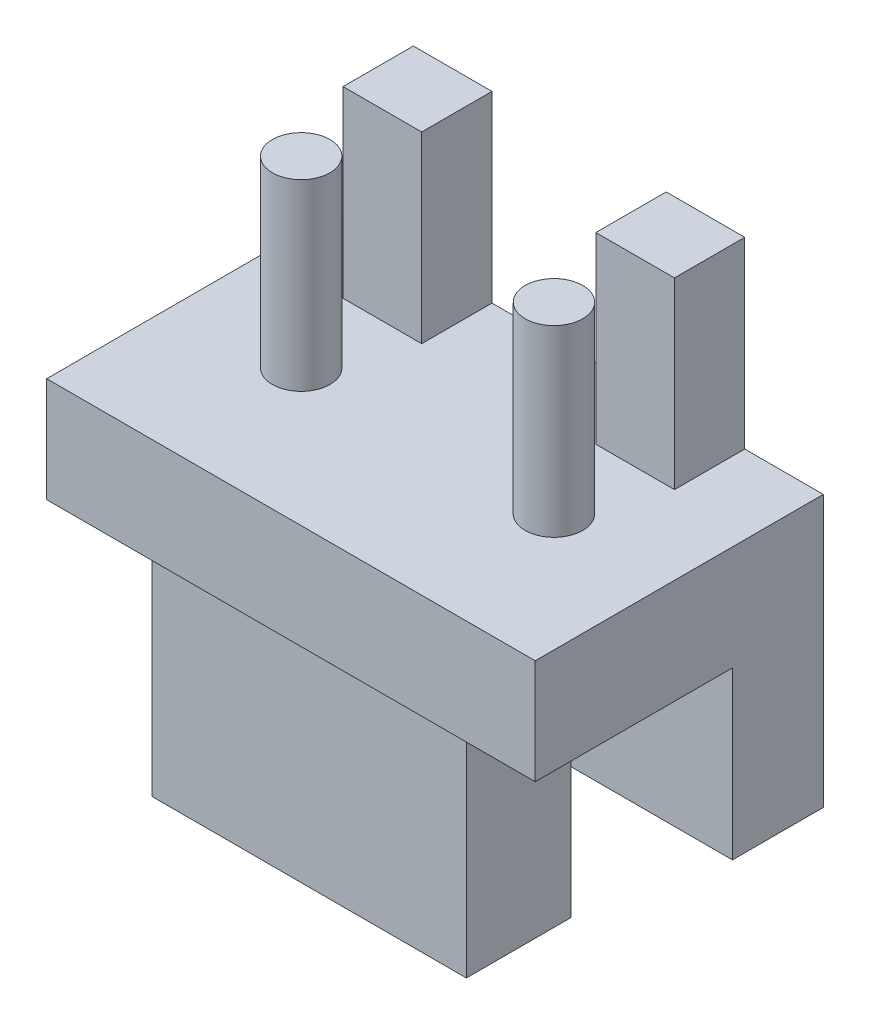
ISO-10303-21;
HEADER;
FILE_DESCRIPTION(('STEP AP214'),'2;1');
FILE_NAME('part.step','',(''),(''),'','','');
FILE_SCHEMA(('AUTOMOTIVE_DESIGN { 1 0 10303 214 1 1 1 1 }'));
ENDSEC;
DATA;
#1=APPLICATION_CONTEXT('core data for automotive mechanical design processes');
#2=APPLICATION_PROTOCOL_DEFINITION('international standard','automotive_design',2000,#1);
#3=PRODUCT_CONTEXT('',#1,'mechanical');
#4=PRODUCT('Part','Part','',(#3));
#5=PRODUCT_RELATED_PRODUCT_CATEGORY('part','',(#4));
#6=PRODUCT_DEFINITION_FORMATION('','',#4);
#7=PRODUCT_DEFINITION_CONTEXT('part definition',#1,'design');
#8=PRODUCT_DEFINITION('design','',#6,#7);
#9=PRODUCT_DEFINITION_SHAPE('','',#8);
#10=(LENGTH_UNIT() NAMED_UNIT(*) SI_UNIT(.MILLI.,.METRE.));
#11=(NAMED_UNIT(*) PLANE_ANGLE_UNIT() SI_UNIT($,.RADIAN.));
#12=(NAMED_UNIT(*) SI_UNIT($,.STERADIAN.) SOLID_ANGLE_UNIT());
#13=UNCERTAINTY_MEASURE_WITH_UNIT(LENGTH_MEASURE(1.E-05),#10,'distance_accuracy_value','');
#14=(GEOMETRIC_REPRESENTATION_CONTEXT(3) GLOBAL_UNCERTAINTY_ASSIGNED_CONTEXT((#13)) GLOBAL_UNIT_ASSIGNED_CONTEXT((#10,
#11,#12)) REPRESENTATION_CONTEXT('',''));
#15=CARTESIAN_POINT('',(0.,0.,0.));
#16=DIRECTION('',(0.,0.,1.));
#17=DIRECTION('',(1.,0.,0.));
#18=AXIS2_PLACEMENT_3D('',#15,#16,#17);
#19=CARTESIAN_POINT('',(0.,9.,0.));
#20=DIRECTION('',(0.,1.,0.));
#21=DIRECTION('',(0.,0.,1.));
#22=AXIS2_PLACEMENT_3D('',#19,#20,#21);
#23=PLANE('',#22);
#24=DIRECTION('',(0.,0.,-1.));
#25=VECTOR('',#24,1.);
#26=CARTESIAN_POINT('',(-20.325,9.,6.978));
#27=LINE('',#26,#25);
#28=CARTESIAN_POINT('',(-20.325,9.,6.978));
#29=VERTEX_POINT('',#28);
#30=CARTESIAN_POINT('',(-20.325,9.,2.978));
#31=VERTEX_POINT('',#30);
#32=EDGE_CURVE('E66',#29,#31,#27,.T.);
#33=ORIENTED_EDGE('',*,*,#32,.F.);
#34=DIRECTION('',(-1.,0.,0.));
#35=VECTOR('',#34,1.);
#36=CARTESIAN_POINT('',(-20.325,9.,6.978));
#37=LINE('',#36,#35);
#38=CARTESIAN_POINT('',(-8.32500000000002,9.,6.978));
#39=VERTEX_POINT('',#38);
#40=EDGE_CURVE('E201',#39,#29,#37,.T.);
#41=ORIENTED_EDGE('',*,*,#40,.F.);
#42=DIRECTION('',(0.,0.,1.));
#43=VECTOR('',#42,1.);
#44=CARTESIAN_POINT('',(-8.32500000000002,9.,6.978));
#45=LINE('',#44,#43);
#46=CARTESIAN_POINT('',(-8.32500000000002,9.,2.978));
#47=VERTEX_POINT('',#46);
#48=EDGE_CURVE('E212',#47,#39,#45,.T.);
#49=ORIENTED_EDGE('',*,*,#48,.F.);
#50=DIRECTION('',(1.,0.,0.));
#51=VECTOR('',#50,1.);
#52=CARTESIAN_POINT('',(-20.325,9.,2.978));
#53=LINE('',#52,#51);
#54=EDGE_CURVE('E209',#31,#47,#53,.T.);
#55=ORIENTED_EDGE('',*,*,#54,.F.);
#56=EDGE_LOOP('',(#33,#41,#49,#55));
#57=FACE_BOUND('',#56,.T.);
#58=DIRECTION('',(-1.,0.,0.));
#59=VECTOR('',#58,1.);
#60=CARTESIAN_POINT('',(-23.65,9.,0.146));
#61=LINE('',#60,#59);
#62=CARTESIAN_POINT('',(-5.00000000000002,9.,0.146));
#63=VERTEX_POINT('',#62);
#64=CARTESIAN_POINT('',(-23.65,9.,0.146));
#65=VERTEX_POINT('',#64);
#66=EDGE_CURVE('E188',#63,#65,#61,.T.);
#67=ORIENTED_EDGE('',*,*,#66,.F.);
#68=DIRECTION('',(0.,0.,-1.));
#69=VECTOR('',#68,1.);
#70=CARTESIAN_POINT('',(-5.00000000000002,9.,-11.5));
#71=LINE('',#70,#69);
#72=CARTESIAN_POINT('',(-5.00000000000002,9.,7.676));
#73=VERTEX_POINT('',#72);
#74=EDGE_CURVE('E230',#73,#63,#71,.T.);
#75=ORIENTED_EDGE('',*,*,#74,.F.);
#76=DIRECTION('',(1.,0.,0.));
#77=VECTOR('',#76,1.);
#78=CARTESIAN_POINT('',(0.,9.,7.676));
#79=LINE('',#78,#77);
#80=CARTESIAN_POINT('',(-23.65,9.,7.676));
#81=VERTEX_POINT('',#80);
#82=EDGE_CURVE('E303',#81,#73,#79,.T.);
#83=ORIENTED_EDGE('',*,*,#82,.F.);
#84=DIRECTION('',(0.,0.,1.));
#85=VECTOR('',#84,1.);
#86=CARTESIAN_POINT('',(-23.65,9.,-3.324));
#87=LINE('',#86,#85);
#88=EDGE_CURVE('E227',#65,#81,#87,.T.);
#89=ORIENTED_EDGE('',*,*,#88,.F.);
#90=EDGE_LOOP('',(#67,#75,#83,#89));
#91=FACE_BOUND('',#90,.T.);
#92=ADVANCED_FACE('F43',(#57,#91),#23,.F.);
#93=CARTESIAN_POINT('',(0.,13.,0.));
#94=DIRECTION('',(0.,1.,0.));
#95=DIRECTION('',(0.,0.,1.));
#96=AXIS2_PLACEMENT_3D('',#93,#94,#95);
#97=PLANE('',#96);
#98=DIRECTION('',(0.,0.,-1.));
#99=VECTOR('',#98,1.);
#100=CARTESIAN_POINT('',(-5.00000000000002,13.,-11.5));
#101=LINE('',#100,#99);
#102=CARTESIAN_POINT('',(-5.00000000000002,13.,7.676));
#103=VERTEX_POINT('',#102);
#104=CARTESIAN_POINT('',(-5.00000000000002,13.,-3.324));
#105=VERTEX_POINT('',#104);
#106=EDGE_CURVE('E233',#103,#105,#101,.T.);
#107=ORIENTED_EDGE('',*,*,#106,.T.);
#108=DIRECTION('',(1.,0.,0.));
#109=VECTOR('',#108,1.);
#110=CARTESIAN_POINT('',(0.,13.,-3.324));
#111=LINE('',#110,#109);
#112=CARTESIAN_POINT('',(-8.00000000000002,13.,-3.324));
#113=VERTEX_POINT('',#112);
#114=EDGE_CURVE('E309',#113,#105,#111,.T.);
#115=ORIENTED_EDGE('',*,*,#114,.F.);
#116=DIRECTION('',(0.,0.,-1.));
#117=VECTOR('',#116,1.);
#118=CARTESIAN_POINT('',(-8.00000000000002,13.,-3.324));
#119=LINE('',#118,#117);
#120=CARTESIAN_POINT('',(-8.00000000000002,13.,-0.640000000000002));
#121=VERTEX_POINT('',#120);
#122=EDGE_CURVE('E244',#121,#113,#119,.T.);
#123=ORIENTED_EDGE('',*,*,#122,.F.);
#124=DIRECTION('',(1.,0.,0.));
#125=VECTOR('',#124,1.);
#126=CARTESIAN_POINT('',(-11.,13.,-0.640000000000002));
#127=LINE('',#126,#125);
#128=CARTESIAN_POINT('',(-11.,13.,-0.640000000000002));
#129=VERTEX_POINT('',#128);
#130=EDGE_CURVE('E253',#129,#121,#127,.T.);
#131=ORIENTED_EDGE('',*,*,#130,.F.);
#132=DIRECTION('',(0.,0.,1.));
#133=VECTOR('',#132,1.);
#134=CARTESIAN_POINT('',(-11.,13.,-3.324));
#135=LINE('',#134,#133);
#136=CARTESIAN_POINT('',(-11.,13.,-3.324));
#137=VERTEX_POINT('',#136);
#138=EDGE_CURVE('E236',#137,#129,#135,.T.);
#139=ORIENTED_EDGE('',*,*,#138,.F.);
#140=CARTESIAN_POINT('',(-17.65,13.,-3.324));
#141=VERTEX_POINT('',#140);
#142=EDGE_CURVE('E308',#141,#137,#111,.T.);
#143=ORIENTED_EDGE('',*,*,#142,.F.);
#144=DIRECTION('',(0.,0.,-1.));
#145=VECTOR('',#144,1.);
#146=CARTESIAN_POINT('',(-17.65,13.,-3.324));
#147=LINE('',#146,#145);
#148=CARTESIAN_POINT('',(-17.65,13.,-0.640000000000002));
#149=VERTEX_POINT('',#148);
#150=EDGE_CURVE('E271',#149,#141,#147,.T.);
#151=ORIENTED_EDGE('',*,*,#150,.F.);
#152=DIRECTION('',(1.,0.,0.));
#153=VECTOR('',#152,1.);
#154=CARTESIAN_POINT('',(-20.65,13.,-0.640000000000002));
#155=LINE('',#154,#153);
#156=CARTESIAN_POINT('',(-20.65,13.,-0.640000000000002));
#157=VERTEX_POINT('',#156);
#158=EDGE_CURVE('E280',#157,#149,#155,.T.);
#159=ORIENTED_EDGE('',*,*,#158,.F.);
#160=DIRECTION('',(0.,0.,1.));
#161=VECTOR('',#160,1.);
#162=CARTESIAN_POINT('',(-20.65,13.,-3.324));
#163=LINE('',#162,#161);
#164=CARTESIAN_POINT('',(-20.65,13.,-3.324));
#165=VERTEX_POINT('',#164);
#166=EDGE_CURVE('E266',#165,#157,#163,.T.);
#167=ORIENTED_EDGE('',*,*,#166,.F.);
#168=CARTESIAN_POINT('',(-23.65,13.,-3.324));
#169=VERTEX_POINT('',#168);
#170=EDGE_CURVE('E306',#169,#165,#111,.T.);
#171=ORIENTED_EDGE('',*,*,#170,.F.);
#172=DIRECTION('',(0.,0.,1.));
#173=VECTOR('',#172,1.);
#174=CARTESIAN_POINT('',(-23.65,13.,-3.324));
#175=LINE('',#174,#173);
#176=CARTESIAN_POINT('',(-23.65,13.,7.676));
#177=VERTEX_POINT('',#176);
#178=EDGE_CURVE('E172',#169,#177,#175,.T.);
#179=ORIENTED_EDGE('',*,*,#178,.T.);
#180=DIRECTION('',(1.,0.,0.));
#181=VECTOR('',#180,1.);
#182=CARTESIAN_POINT('',(0.,13.,7.676));
#183=LINE('',#182,#181);
#184=EDGE_CURVE('E51',#177,#103,#183,.T.);
#185=ORIENTED_EDGE('',*,*,#184,.T.);
#186=EDGE_LOOP('',(#107,#115,#123,#131,#139,#143,#151,#159,#167,#171,#179,#185));
#187=FACE_BOUND('',#186,.T.);
#188=CARTESIAN_POINT('',(-9.50000000000002,13.,2.46));
#189=DIRECTION('',(0.,1.,0.));
#190=DIRECTION('',(0.,0.,1.));
#191=AXIS2_PLACEMENT_3D('',#188,#189,#190);
#192=CIRCLE('',#191,1.1);
#193=CARTESIAN_POINT('',(-9.50000000000002,13.,3.56));
#194=VERTEX_POINT('',#193);
#195=EDGE_CURVE('E293',#194,#194,#192,.T.);
#196=ORIENTED_EDGE('',*,*,#195,.F.);
#197=EDGE_LOOP('',(#196));
#198=FACE_BOUND('',#197,.T.);
#199=CARTESIAN_POINT('',(-19.15,13.,2.46));
#200=DIRECTION('',(0.,1.,0.));
#201=DIRECTION('',(0.,0.,1.));
#202=AXIS2_PLACEMENT_3D('',#199,#200,#201);
#203=CIRCLE('',#202,1.1);
#204=CARTESIAN_POINT('',(-19.15,13.,3.56));
#205=VERTEX_POINT('',#204);
#206=EDGE_CURVE('E297',#205,#205,#203,.T.);
#207=ORIENTED_EDGE('',*,*,#206,.F.);
#208=EDGE_LOOP('',(#207));
#209=FACE_BOUND('',#208,.T.);
#210=ADVANCED_FACE('F326',(#187,#198,#209),#97,.T.);
#211=CARTESIAN_POINT('',(0.,13.,-3.324));
#212=DIRECTION('',(0.,0.,-1.));
#213=DIRECTION('',(-1.,0.,0.));
#214=AXIS2_PLACEMENT_3D('',#211,#212,#213);
#215=PLANE('',#214);
#216=DIRECTION('',(0.,1.,0.));
#217=VECTOR('',#216,1.);
#218=CARTESIAN_POINT('',(-23.65,-0.001000000000001,-3.324));
#219=LINE('',#218,#217);
#220=CARTESIAN_POINT('',(-23.65,2.65,-3.324));
#221=VERTEX_POINT('',#220);
#222=EDGE_CURVE('E166',#221,#169,#219,.T.);
#223=ORIENTED_EDGE('',*,*,#222,.T.);
#224=ORIENTED_EDGE('',*,*,#170,.T.);
#225=DIRECTION('',(0.,-1.,0.));
#226=VECTOR('',#225,1.);
#227=CARTESIAN_POINT('',(-20.65,20.,-3.324));
#228=LINE('',#227,#226);
#229=CARTESIAN_POINT('',(-20.65,20.,-3.324));
#230=VERTEX_POINT('',#229);
#231=EDGE_CURVE('E277',#230,#165,#228,.T.);
#232=ORIENTED_EDGE('',*,*,#231,.F.);
#233=DIRECTION('',(-1.,0.,0.));
#234=VECTOR('',#233,1.);
#235=CARTESIAN_POINT('',(-20.65,20.,-3.324));
#236=LINE('',#235,#234);
#237=CARTESIAN_POINT('',(-17.65,20.,-3.324));
#238=VERTEX_POINT('',#237);
#239=EDGE_CURVE('E275',#238,#230,#236,.T.);
#240=ORIENTED_EDGE('',*,*,#239,.F.);
#241=DIRECTION('',(0.,-1.,0.));
#242=VECTOR('',#241,1.);
#243=CARTESIAN_POINT('',(-17.65,20.,-3.324));
#244=LINE('',#243,#242);
#245=EDGE_CURVE('E286',#238,#141,#244,.T.);
#246=ORIENTED_EDGE('',*,*,#245,.T.);
#247=ORIENTED_EDGE('',*,*,#142,.T.);
#248=DIRECTION('',(0.,-1.,0.));
#249=VECTOR('',#248,1.);
#250=CARTESIAN_POINT('',(-11.,20.,-3.324));
#251=LINE('',#250,#249);
#252=CARTESIAN_POINT('',(-11.,20.,-3.324));
#253=VERTEX_POINT('',#252);
#254=EDGE_CURVE('E250',#253,#137,#251,.T.);
#255=ORIENTED_EDGE('',*,*,#254,.F.);
#256=DIRECTION('',(-1.,0.,0.));
#257=VECTOR('',#256,1.);
#258=CARTESIAN_POINT('',(-11.,20.,-3.324));
#259=LINE('',#258,#257);
#260=CARTESIAN_POINT('',(-8.00000000000002,20.,-3.324));
#261=VERTEX_POINT('',#260);
#262=EDGE_CURVE('E248',#261,#253,#259,.T.);
#263=ORIENTED_EDGE('',*,*,#262,.F.);
#264=DIRECTION('',(0.,-1.,0.));
#265=VECTOR('',#264,1.);
#266=CARTESIAN_POINT('',(-8.00000000000002,20.,-3.324));
#267=LINE('',#266,#265);
#268=EDGE_CURVE('E258',#261,#113,#267,.T.);
#269=ORIENTED_EDGE('',*,*,#268,.T.);
#270=ORIENTED_EDGE('',*,*,#114,.T.);
#271=DIRECTION('',(0.,-1.,0.));
#272=VECTOR('',#271,1.);
#273=CARTESIAN_POINT('',(-5.00000000000002,13.,-3.324));
#274=LINE('',#273,#272);
#275=CARTESIAN_POINT('',(-5.00000000000002,2.65,-3.324));
#276=VERTEX_POINT('',#275);
#277=EDGE_CURVE('E11',#105,#276,#274,.T.);
#278=ORIENTED_EDGE('',*,*,#277,.T.);
#279=DIRECTION('',(1.,0.,0.));
#280=VECTOR('',#279,1.);
#281=CARTESIAN_POINT('',(-23.65,2.65,-3.324));
#282=LINE('',#281,#280);
#283=EDGE_CURVE('E179',#221,#276,#282,.T.);
#284=ORIENTED_EDGE('',*,*,#283,.F.);
#285=EDGE_LOOP('',(#223,#224,#232,#240,#246,#247,#255,#263,#269,#270,#278,#284));
#286=FACE_BOUND('',#285,.T.);
#287=ADVANCED_FACE('F45',(#286),#215,.T.);
#288=CARTESIAN_POINT('',(0.,13.,7.676));
#289=DIRECTION('',(0.,0.,-1.));
#290=DIRECTION('',(-1.,0.,0.));
#291=AXIS2_PLACEMENT_3D('',#288,#289,#290);
#292=PLANE('',#291);
#293=ORIENTED_EDGE('',*,*,#82,.T.);
#294=DIRECTION('',(0.,1.,0.));
#295=VECTOR('',#294,1.);
#296=CARTESIAN_POINT('',(-5.00000000000002,-0.001000000000001,7.676));
#297=LINE('',#296,#295);
#298=EDGE_CURVE('E175',#73,#103,#297,.T.);
#299=ORIENTED_EDGE('',*,*,#298,.T.);
#300=ORIENTED_EDGE('',*,*,#184,.F.);
#301=DIRECTION('',(0.,1.,0.));
#302=VECTOR('',#301,1.);
#303=CARTESIAN_POINT('',(-23.65,-0.001000000000001,7.676));
#304=LINE('',#303,#302);
#305=EDGE_CURVE('E176',#81,#177,#304,.T.);
#306=ORIENTED_EDGE('',*,*,#305,.F.);
#307=EDGE_LOOP('',(#293,#299,#300,#306));
#308=FACE_BOUND('',#307,.T.);
#309=ADVANCED_FACE('F345',(#308),#292,.F.);
#310=CARTESIAN_POINT('',(-19.15,20.,2.46));
#311=DIRECTION('',(0.,-1.,0.));
#312=DIRECTION('',(0.,0.,-1.));
#313=AXIS2_PLACEMENT_3D('',#310,#311,#312);
#314=CYLINDRICAL_SURFACE('',#313,1.1);
#315=CARTESIAN_POINT('',(-19.15,20.,2.46));
#316=DIRECTION('',(0.,1.,0.));
#317=DIRECTION('',(0.,0.,1.));
#318=AXIS2_PLACEMENT_3D('',#315,#316,#317);
#319=CIRCLE('',#318,1.1);
#320=CARTESIAN_POINT('',(-19.15,20.,3.56));
#321=VERTEX_POINT('',#320);
#322=EDGE_CURVE('E300',#321,#321,#319,.T.);
#323=ORIENTED_EDGE('',*,*,#322,.F.);
#324=EDGE_LOOP('',(#323));
#325=FACE_BOUND('',#324,.T.);
#326=ORIENTED_EDGE('',*,*,#206,.T.);
#327=EDGE_LOOP('',(#326));
#328=FACE_BOUND('',#327,.T.);
#329=ADVANCED_FACE('F373',(#325,#328),#314,.T.);
#330=CARTESIAN_POINT('',(-19.15,20.,2.46));
#331=DIRECTION('',(0.,1.,0.));
#332=DIRECTION('',(0.,0.,1.));
#333=AXIS2_PLACEMENT_3D('',#330,#331,#332);
#334=PLANE('',#333);
#335=ORIENTED_EDGE('',*,*,#322,.T.);
#336=EDGE_LOOP('',(#335));
#337=FACE_BOUND('',#336,.T.);
#338=ADVANCED_FACE('F378',(#337),#334,.T.);
#339=CARTESIAN_POINT('',(-9.50000000000002,20.,2.46));
#340=DIRECTION('',(0.,-1.,0.));
#341=DIRECTION('',(0.,0.,-1.));
#342=AXIS2_PLACEMENT_3D('',#339,#340,#341);
#343=CYLINDRICAL_SURFACE('',#342,1.1);
#344=CARTESIAN_POINT('',(-9.50000000000002,20.,2.46));
#345=DIRECTION('',(0.,1.,0.));
#346=DIRECTION('',(0.,0.,1.));
#347=AXIS2_PLACEMENT_3D('',#344,#345,#346);
#348=CIRCLE('',#347,1.1);
#349=CARTESIAN_POINT('',(-9.50000000000002,20.,3.56));
#350=VERTEX_POINT('',#349);
#351=EDGE_CURVE('E294',#350,#350,#348,.T.);
#352=ORIENTED_EDGE('',*,*,#351,.F.);
#353=EDGE_LOOP('',(#352));
#354=FACE_BOUND('',#353,.T.);
#355=ORIENTED_EDGE('',*,*,#195,.T.);
#356=EDGE_LOOP('',(#355));
#357=FACE_BOUND('',#356,.T.);
#358=ADVANCED_FACE('F498',(#354,#357),#343,.T.);
#359=CARTESIAN_POINT('',(-9.50000000000002,20.,2.46));
#360=DIRECTION('',(0.,1.,0.));
#361=DIRECTION('',(0.,0.,1.));
#362=AXIS2_PLACEMENT_3D('',#359,#360,#361);
#363=PLANE('',#362);
#364=ORIENTED_EDGE('',*,*,#351,.T.);
#365=EDGE_LOOP('',(#364));
#366=FACE_BOUND('',#365,.T.);
#367=ADVANCED_FACE('F506',(#366),#363,.T.);
#368=CARTESIAN_POINT('',(-20.65,20.,-3.324));
#369=DIRECTION('',(1.,0.,0.));
#370=DIRECTION('',(0.,0.,-1.));
#371=AXIS2_PLACEMENT_3D('',#368,#369,#370);
#372=PLANE('',#371);
#373=ORIENTED_EDGE('',*,*,#166,.T.);
#374=DIRECTION('',(0.,-1.,0.));
#375=VECTOR('',#374,1.);
#376=CARTESIAN_POINT('',(-20.65,20.,-0.640000000000002));
#377=LINE('',#376,#375);
#378=CARTESIAN_POINT('',(-20.65,20.,-0.640000000000002));
#379=VERTEX_POINT('',#378);
#380=EDGE_CURVE('E291',#379,#157,#377,.T.);
#381=ORIENTED_EDGE('',*,*,#380,.F.);
#382=DIRECTION('',(0.,0.,1.));
#383=VECTOR('',#382,1.);
#384=CARTESIAN_POINT('',(-20.65,20.,-3.324));
#385=LINE('',#384,#383);
#386=EDGE_CURVE('E267',#230,#379,#385,.T.);
#387=ORIENTED_EDGE('',*,*,#386,.F.);
#388=ORIENTED_EDGE('',*,*,#231,.T.);
#389=EDGE_LOOP('',(#373,#381,#387,#388));
#390=FACE_BOUND('',#389,.T.);
#391=ADVANCED_FACE('F514',(#390),#372,.F.);
#392=CARTESIAN_POINT('',(-20.65,20.,-0.640000000000002));
#393=DIRECTION('',(0.,0.,-1.));
#394=DIRECTION('',(-1.,0.,0.));
#395=AXIS2_PLACEMENT_3D('',#392,#393,#394);
#396=PLANE('',#395);
#397=ORIENTED_EDGE('',*,*,#158,.T.);
#398=DIRECTION('',(0.,-1.,0.));
#399=VECTOR('',#398,1.);
#400=CARTESIAN_POINT('',(-17.65,20.,-0.640000000000002));
#401=LINE('',#400,#399);
#402=CARTESIAN_POINT('',(-17.65,20.,-0.640000000000002));
#403=VERTEX_POINT('',#402);
#404=EDGE_CURVE('E288',#403,#149,#401,.T.);
#405=ORIENTED_EDGE('',*,*,#404,.F.);
#406=DIRECTION('',(1.,0.,0.));
#407=VECTOR('',#406,1.);
#408=CARTESIAN_POINT('',(-20.65,20.,-0.640000000000002));
#409=LINE('',#408,#407);
#410=EDGE_CURVE('E270',#379,#403,#409,.T.);
#411=ORIENTED_EDGE('',*,*,#410,.F.);
#412=ORIENTED_EDGE('',*,*,#380,.T.);
#413=EDGE_LOOP('',(#397,#405,#411,#412));
#414=FACE_BOUND('',#413,.T.);
#415=ADVANCED_FACE('F522',(#414),#396,.F.);
#416=CARTESIAN_POINT('',(-17.65,20.,-3.324));
#417=DIRECTION('',(-1.,0.,0.));
#418=DIRECTION('',(0.,0.,1.));
#419=AXIS2_PLACEMENT_3D('',#416,#417,#418);
#420=PLANE('',#419);
#421=ORIENTED_EDGE('',*,*,#150,.T.);
#422=ORIENTED_EDGE('',*,*,#245,.F.);
#423=DIRECTION('',(0.,0.,-1.));
#424=VECTOR('',#423,1.);
#425=CARTESIAN_POINT('',(-17.65,20.,-3.324));
#426=LINE('',#425,#424);
#427=EDGE_CURVE('E273',#403,#238,#426,.T.);
#428=ORIENTED_EDGE('',*,*,#427,.F.);
#429=ORIENTED_EDGE('',*,*,#404,.T.);
#430=EDGE_LOOP('',(#421,#422,#428,#429));
#431=FACE_BOUND('',#430,.T.);
#432=ADVANCED_FACE('F530',(#431),#420,.F.);
#433=CARTESIAN_POINT('',(0.,20.,0.));
#434=DIRECTION('',(0.,1.,0.));
#435=DIRECTION('',(0.,0.,1.));
#436=AXIS2_PLACEMENT_3D('',#433,#434,#435);
#437=PLANE('',#436);
#438=ORIENTED_EDGE('',*,*,#386,.T.);
#439=ORIENTED_EDGE('',*,*,#410,.T.);
#440=ORIENTED_EDGE('',*,*,#427,.T.);
#441=ORIENTED_EDGE('',*,*,#239,.T.);
#442=EDGE_LOOP('',(#438,#439,#440,#441));
#443=FACE_BOUND('',#442,.T.);
#444=ADVANCED_FACE('F538',(#443),#437,.T.);
#445=CARTESIAN_POINT('',(-11.,20.,-3.324));
#446=DIRECTION('',(1.,0.,0.));
#447=DIRECTION('',(0.,0.,-1.));
#448=AXIS2_PLACEMENT_3D('',#445,#446,#447);
#449=PLANE('',#448);
#450=ORIENTED_EDGE('',*,*,#138,.T.);
#451=DIRECTION('',(0.,-1.,0.));
#452=VECTOR('',#451,1.);
#453=CARTESIAN_POINT('',(-11.,20.,-0.640000000000002));
#454=LINE('',#453,#452);
#455=CARTESIAN_POINT('',(-11.,20.,-0.640000000000002));
#456=VERTEX_POINT('',#455);
#457=EDGE_CURVE('E264',#456,#129,#454,.T.);
#458=ORIENTED_EDGE('',*,*,#457,.F.);
#459=DIRECTION('',(0.,0.,1.));
#460=VECTOR('',#459,1.);
#461=CARTESIAN_POINT('',(-11.,20.,-3.324));
#462=LINE('',#461,#460);
#463=EDGE_CURVE('E240',#253,#456,#462,.T.);
#464=ORIENTED_EDGE('',*,*,#463,.F.);
#465=ORIENTED_EDGE('',*,*,#254,.T.);
#466=EDGE_LOOP('',(#450,#458,#464,#465));
#467=FACE_BOUND('',#466,.T.);
#468=ADVANCED_FACE('F333',(#467),#449,.F.);
#469=CARTESIAN_POINT('',(-11.,20.,-0.640000000000002));
#470=DIRECTION('',(0.,0.,-1.));
#471=DIRECTION('',(-1.,0.,0.));
#472=AXIS2_PLACEMENT_3D('',#469,#470,#471);
#473=PLANE('',#472);
#474=ORIENTED_EDGE('',*,*,#130,.T.);
#475=DIRECTION('',(0.,-1.,0.));
#476=VECTOR('',#475,1.);
#477=CARTESIAN_POINT('',(-8.00000000000002,20.,-0.640000000000002));
#478=LINE('',#477,#476);
#479=CARTESIAN_POINT('',(-8.00000000000002,20.,-0.640000000000002));
#480=VERTEX_POINT('',#479);
#481=EDGE_CURVE('E260',#480,#121,#478,.T.);
#482=ORIENTED_EDGE('',*,*,#481,.F.);
#483=DIRECTION('',(1.,0.,0.));
#484=VECTOR('',#483,1.);
#485=CARTESIAN_POINT('',(-11.,20.,-0.640000000000002));
#486=LINE('',#485,#484);
#487=EDGE_CURVE('E243',#456,#480,#486,.T.);
#488=ORIENTED_EDGE('',*,*,#487,.F.);
#489=ORIENTED_EDGE('',*,*,#457,.T.);
#490=EDGE_LOOP('',(#474,#482,#488,#489));
#491=FACE_BOUND('',#490,.T.);
#492=ADVANCED_FACE('F553',(#491),#473,.F.);
#493=CARTESIAN_POINT('',(-8.00000000000002,20.,-3.324));
#494=DIRECTION('',(-1.,0.,0.));
#495=DIRECTION('',(0.,0.,1.));
#496=AXIS2_PLACEMENT_3D('',#493,#494,#495);
#497=PLANE('',#496);
#498=ORIENTED_EDGE('',*,*,#122,.T.);
#499=ORIENTED_EDGE('',*,*,#268,.F.);
#500=DIRECTION('',(0.,0.,-1.));
#501=VECTOR('',#500,1.);
#502=CARTESIAN_POINT('',(-8.00000000000002,20.,-3.324));
#503=LINE('',#502,#501);
#504=EDGE_CURVE('E246',#480,#261,#503,.T.);
#505=ORIENTED_EDGE('',*,*,#504,.F.);
#506=ORIENTED_EDGE('',*,*,#481,.T.);
#507=EDGE_LOOP('',(#498,#499,#505,#506));
#508=FACE_BOUND('',#507,.T.);
#509=ADVANCED_FACE('F340',(#508),#497,.F.);
#510=CARTESIAN_POINT('',(0.,20.,0.));
#511=DIRECTION('',(0.,1.,0.));
#512=DIRECTION('',(0.,0.,1.));
#513=AXIS2_PLACEMENT_3D('',#510,#511,#512);
#514=PLANE('',#513);
#515=ORIENTED_EDGE('',*,*,#463,.T.);
#516=ORIENTED_EDGE('',*,*,#487,.T.);
#517=ORIENTED_EDGE('',*,*,#504,.T.);
#518=ORIENTED_EDGE('',*,*,#262,.T.);
#519=EDGE_LOOP('',(#515,#516,#517,#518));
#520=FACE_BOUND('',#519,.T.);
#521=ADVANCED_FACE('F335',(#520),#514,.T.);
#522=CARTESIAN_POINT('',(-5.00000000000002,-0.001000000000001,-11.5));
#523=DIRECTION('',(-1.,0.,0.));
#524=DIRECTION('',(0.,0.,1.));
#525=AXIS2_PLACEMENT_3D('',#522,#523,#524);
#526=PLANE('',#525);
#527=ORIENTED_EDGE('',*,*,#298,.F.);
#528=ORIENTED_EDGE('',*,*,#74,.T.);
#529=DIRECTION('',(0.,1.,0.));
#530=VECTOR('',#529,1.);
#531=CARTESIAN_POINT('',(-5.00000000000002,2.65,0.146));
#532=LINE('',#531,#530);
#533=CARTESIAN_POINT('',(-5.00000000000002,2.65,0.146));
#534=VERTEX_POINT('',#533);
#535=EDGE_CURVE('E195',#534,#63,#532,.T.);
#536=ORIENTED_EDGE('',*,*,#535,.F.);
#537=DIRECTION('',(0.,0.,1.));
#538=VECTOR('',#537,1.);
#539=CARTESIAN_POINT('',(-5.00000000000002,2.65,-3.324));
#540=LINE('',#539,#538);
#541=EDGE_CURVE('E183',#276,#534,#540,.T.);
#542=ORIENTED_EDGE('',*,*,#541,.F.);
#543=ORIENTED_EDGE('',*,*,#277,.F.);
#544=ORIENTED_EDGE('',*,*,#106,.F.);
#545=EDGE_LOOP('',(#527,#528,#536,#542,#543,#544));
#546=FACE_BOUND('',#545,.T.);
#547=ADVANCED_FACE('F343',(#546),#526,.F.);
#548=CARTESIAN_POINT('',(-23.65,-0.001000000000001,-3.324));
#549=DIRECTION('',(1.,0.,0.));
#550=DIRECTION('',(0.,0.,-1.));
#551=AXIS2_PLACEMENT_3D('',#548,#549,#550);
#552=PLANE('',#551);
#553=ORIENTED_EDGE('',*,*,#222,.F.);
#554=DIRECTION('',(0.,0.,-1.));
#555=VECTOR('',#554,1.);
#556=CARTESIAN_POINT('',(-23.65,2.65,-3.324));
#557=LINE('',#556,#555);
#558=CARTESIAN_POINT('',(-23.65,2.65,0.146));
#559=VERTEX_POINT('',#558);
#560=EDGE_CURVE('E170',#559,#221,#557,.T.);
#561=ORIENTED_EDGE('',*,*,#560,.F.);
#562=DIRECTION('',(0.,1.,0.));
#563=VECTOR('',#562,1.);
#564=CARTESIAN_POINT('',(-23.65,2.65,0.146));
#565=LINE('',#564,#563);
#566=EDGE_CURVE('E58',#559,#65,#565,.T.);
#567=ORIENTED_EDGE('',*,*,#566,.T.);
#568=ORIENTED_EDGE('',*,*,#88,.T.);
#569=ORIENTED_EDGE('',*,*,#305,.T.);
#570=ORIENTED_EDGE('',*,*,#178,.F.);
#571=EDGE_LOOP('',(#553,#561,#567,#568,#569,#570));
#572=FACE_BOUND('',#571,.T.);
#573=ADVANCED_FACE('F168',(#572),#552,.F.);
#574=CARTESIAN_POINT('',(-20.325,0.5,6.978));
#575=DIRECTION('',(1.,0.,0.));
#576=DIRECTION('',(0.,0.,-1.));
#577=AXIS2_PLACEMENT_3D('',#574,#575,#576);
#578=PLANE('',#577);
#579=ORIENTED_EDGE('',*,*,#32,.T.);
#580=DIRECTION('',(0.,1.,0.));
#581=VECTOR('',#580,1.);
#582=CARTESIAN_POINT('',(-20.325,0.5,2.978));
#583=LINE('',#582,#581);
#584=CARTESIAN_POINT('',(-20.325,0.5,2.978));
#585=VERTEX_POINT('',#584);
#586=EDGE_CURVE('E224',#585,#31,#583,.T.);
#587=ORIENTED_EDGE('',*,*,#586,.F.);
#588=DIRECTION('',(0.,0.,-1.));
#589=VECTOR('',#588,1.);
#590=CARTESIAN_POINT('',(-20.325,0.5,6.978));
#591=LINE('',#590,#589);
#592=CARTESIAN_POINT('',(-20.325,0.5,6.978));
#593=VERTEX_POINT('',#592);
#594=EDGE_CURVE('E197',#593,#585,#591,.T.);
#595=ORIENTED_EDGE('',*,*,#594,.F.);
#596=DIRECTION('',(0.,1.,0.));
#597=VECTOR('',#596,1.);
#598=CARTESIAN_POINT('',(-20.325,0.5,6.978));
#599=LINE('',#598,#597);
#600=EDGE_CURVE('E207',#593,#29,#599,.T.);
#601=ORIENTED_EDGE('',*,*,#600,.T.);
#602=EDGE_LOOP('',(#579,#587,#595,#601));
#603=FACE_BOUND('',#602,.T.);
#604=ADVANCED_FACE('F397',(#603),#578,.F.);
#605=CARTESIAN_POINT('',(-20.325,0.5,2.978));
#606=DIRECTION('',(0.,0.,1.));
#607=DIRECTION('',(1.,0.,0.));
#608=AXIS2_PLACEMENT_3D('',#605,#606,#607);
#609=PLANE('',#608);
#610=ORIENTED_EDGE('',*,*,#54,.T.);
#611=DIRECTION('',(0.,1.,0.));
#612=VECTOR('',#611,1.);
#613=CARTESIAN_POINT('',(-8.32500000000002,0.5,2.978));
#614=LINE('',#613,#612);
#615=CARTESIAN_POINT('',(-8.32500000000002,0.5,2.978));
#616=VERTEX_POINT('',#615);
#617=EDGE_CURVE('E221',#616,#47,#614,.T.);
#618=ORIENTED_EDGE('',*,*,#617,.F.);
#619=DIRECTION('',(1.,0.,0.));
#620=VECTOR('',#619,1.);
#621=CARTESIAN_POINT('',(-20.325,0.5,2.978));
#622=LINE('',#621,#620);
#623=EDGE_CURVE('E200',#585,#616,#622,.T.);
#624=ORIENTED_EDGE('',*,*,#623,.F.);
#625=ORIENTED_EDGE('',*,*,#586,.T.);
#626=EDGE_LOOP('',(#610,#618,#624,#625));
#627=FACE_BOUND('',#626,.T.);
#628=ADVANCED_FACE('F403',(#627),#609,.F.);
#629=CARTESIAN_POINT('',(-8.32500000000002,0.5,6.978));
#630=DIRECTION('',(-1.,0.,0.));
#631=DIRECTION('',(0.,0.,1.));
#632=AXIS2_PLACEMENT_3D('',#629,#630,#631);
#633=PLANE('',#632);
#634=ORIENTED_EDGE('',*,*,#48,.T.);
#635=DIRECTION('',(0.,1.,0.));
#636=VECTOR('',#635,1.);
#637=CARTESIAN_POINT('',(-8.32500000000002,0.5,6.978));
#638=LINE('',#637,#636);
#639=CARTESIAN_POINT('',(-8.32500000000002,0.5,6.978));
#640=VERTEX_POINT('',#639);
#641=EDGE_CURVE('E218',#640,#39,#638,.T.);
#642=ORIENTED_EDGE('',*,*,#641,.F.);
#643=DIRECTION('',(0.,0.,1.));
#644=VECTOR('',#643,1.);
#645=CARTESIAN_POINT('',(-8.32500000000002,0.5,6.978));
#646=LINE('',#645,#644);
#647=EDGE_CURVE('E203',#616,#640,#646,.T.);
#648=ORIENTED_EDGE('',*,*,#647,.F.);
#649=ORIENTED_EDGE('',*,*,#617,.T.);
#650=EDGE_LOOP('',(#634,#642,#648,#649));
#651=FACE_BOUND('',#650,.T.);
#652=ADVANCED_FACE('F411',(#651),#633,.F.);
#653=CARTESIAN_POINT('',(-20.325,0.5,6.978));
#654=DIRECTION('',(0.,0.,-1.));
#655=DIRECTION('',(-1.,0.,0.));
#656=AXIS2_PLACEMENT_3D('',#653,#654,#655);
#657=PLANE('',#656);
#658=ORIENTED_EDGE('',*,*,#40,.T.);
#659=ORIENTED_EDGE('',*,*,#600,.F.);
#660=DIRECTION('',(-1.,0.,0.));
#661=VECTOR('',#660,1.);
#662=CARTESIAN_POINT('',(-20.325,0.5,6.978));
#663=LINE('',#662,#661);
#664=EDGE_CURVE('E205',#640,#593,#663,.T.);
#665=ORIENTED_EDGE('',*,*,#664,.F.);
#666=ORIENTED_EDGE('',*,*,#641,.T.);
#667=EDGE_LOOP('',(#658,#659,#665,#666));
#668=FACE_BOUND('',#667,.T.);
#669=ADVANCED_FACE('F360',(#668),#657,.F.);
#670=CARTESIAN_POINT('',(0.,0.5,0.));
#671=DIRECTION('',(0.,-1.,0.));
#672=DIRECTION('',(0.,0.,-1.));
#673=AXIS2_PLACEMENT_3D('',#670,#671,#672);
#674=PLANE('',#673);
#675=ORIENTED_EDGE('',*,*,#594,.T.);
#676=ORIENTED_EDGE('',*,*,#623,.T.);
#677=ORIENTED_EDGE('',*,*,#647,.T.);
#678=ORIENTED_EDGE('',*,*,#664,.T.);
#679=EDGE_LOOP('',(#675,#676,#677,#678));
#680=FACE_BOUND('',#679,.T.);
#681=ADVANCED_FACE('F353',(#680),#674,.T.);
#682=CARTESIAN_POINT('',(-23.65,2.65,0.146));
#683=DIRECTION('',(0.,0.,-1.));
#684=DIRECTION('',(-1.,0.,0.));
#685=AXIS2_PLACEMENT_3D('',#682,#683,#684);
#686=PLANE('',#685);
#687=ORIENTED_EDGE('',*,*,#66,.T.);
#688=ORIENTED_EDGE('',*,*,#566,.F.);
#689=DIRECTION('',(-1.,0.,0.));
#690=VECTOR('',#689,1.);
#691=CARTESIAN_POINT('',(-23.65,2.65,0.146));
#692=LINE('',#691,#690);
#693=EDGE_CURVE('E187',#534,#559,#692,.T.);
#694=ORIENTED_EDGE('',*,*,#693,.F.);
#695=ORIENTED_EDGE('',*,*,#535,.T.);
#696=EDGE_LOOP('',(#687,#688,#694,#695));
#697=FACE_BOUND('',#696,.T.);
#698=ADVANCED_FACE('F351',(#697),#686,.F.);
#699=CARTESIAN_POINT('',(0.,2.65,0.));
#700=DIRECTION('',(0.,1.,0.));
#701=DIRECTION('',(0.,0.,1.));
#702=AXIS2_PLACEMENT_3D('',#699,#700,#701);
#703=PLANE('',#702);
#704=ORIENTED_EDGE('',*,*,#560,.T.);
#705=ORIENTED_EDGE('',*,*,#283,.T.);
#706=ORIENTED_EDGE('',*,*,#541,.T.);
#707=ORIENTED_EDGE('',*,*,#693,.T.);
#708=EDGE_LOOP('',(#704,#705,#706,#707));
#709=FACE_BOUND('',#708,.T.);
#710=ADVANCED_FACE('F185',(#709),#703,.F.);
#711=CLOSED_SHELL('',(#92,#210,#287,#309,#329,#338,#358,#367,#391,#415,#432,#444,#468,#492,#509,
#521,#547,#573,#604,#628,#652,#669,#681,#698,#710));
#712=MANIFOLD_SOLID_BREP('B2',#711);
#713=ADVANCED_BREP_SHAPE_REPRESENTATION('',(#18,#712),#14);
#714=SHAPE_DEFINITION_REPRESENTATION(#9,#713);
ENDSEC;
END-ISO-10303-21;
